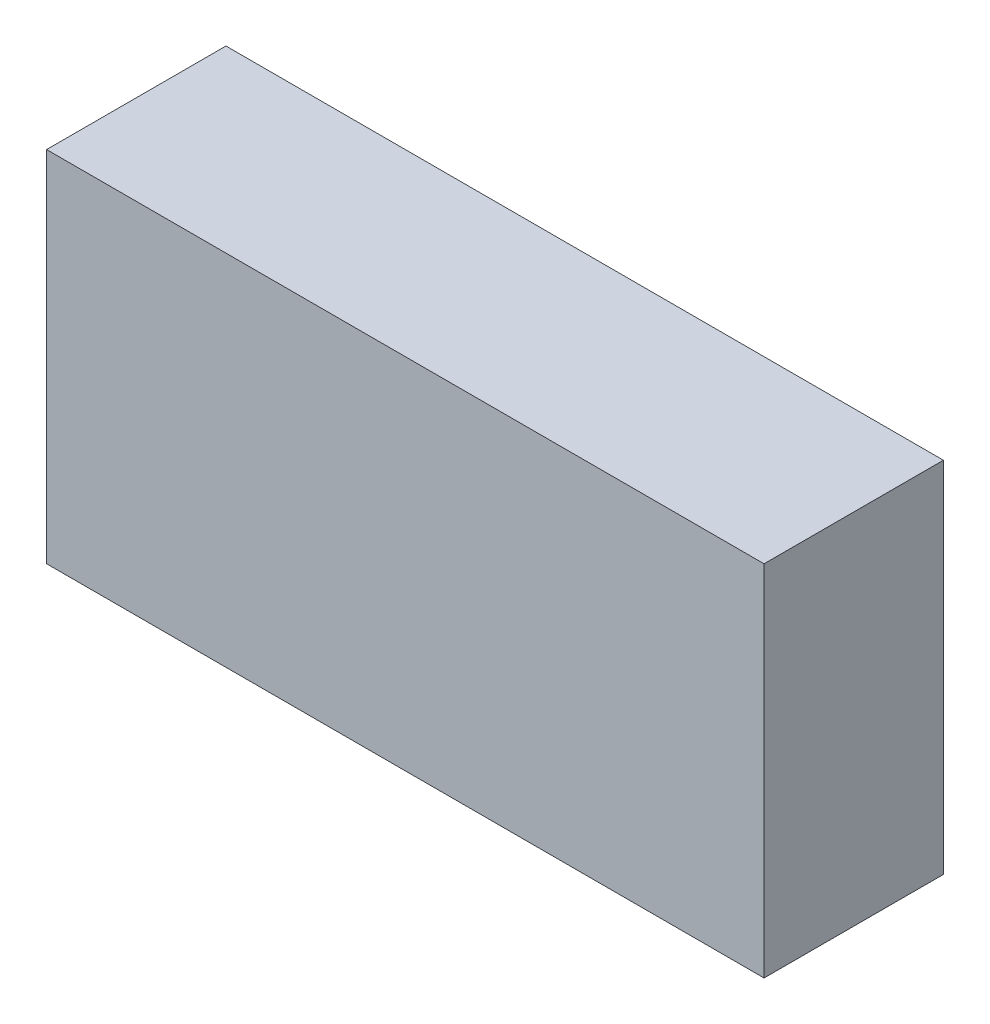
ISO-10303-21;
HEADER;
FILE_DESCRIPTION(('STEP AP214'),'2;1');
FILE_NAME('part.step','',(''),(''),'','','');
FILE_SCHEMA(('AUTOMOTIVE_DESIGN { 1 0 10303 214 1 1 1 1 }'));
ENDSEC;
DATA;
#1=APPLICATION_CONTEXT('core data for automotive mechanical design processes');
#2=APPLICATION_PROTOCOL_DEFINITION('international standard','automotive_design',2000,#1);
#3=PRODUCT_CONTEXT('',#1,'mechanical');
#4=PRODUCT('Part','Part','',(#3));
#5=PRODUCT_RELATED_PRODUCT_CATEGORY('part','',(#4));
#6=PRODUCT_DEFINITION_FORMATION('','',#4);
#7=PRODUCT_DEFINITION_CONTEXT('part definition',#1,'design');
#8=PRODUCT_DEFINITION('design','',#6,#7);
#9=PRODUCT_DEFINITION_SHAPE('','',#8);
#10=(LENGTH_UNIT() NAMED_UNIT(*) SI_UNIT(.MILLI.,.METRE.));
#11=(NAMED_UNIT(*) PLANE_ANGLE_UNIT() SI_UNIT($,.RADIAN.));
#12=(NAMED_UNIT(*) SI_UNIT($,.STERADIAN.) SOLID_ANGLE_UNIT());
#13=UNCERTAINTY_MEASURE_WITH_UNIT(LENGTH_MEASURE(1.E-05),#10,'distance_accuracy_value','');
#14=(GEOMETRIC_REPRESENTATION_CONTEXT(3) GLOBAL_UNCERTAINTY_ASSIGNED_CONTEXT((#13)) GLOBAL_UNIT_ASSIGNED_CONTEXT((#10,
#11,#12)) REPRESENTATION_CONTEXT('',''));
#15=CARTESIAN_POINT('',(0.,0.,0.));
#16=DIRECTION('',(0.,0.,1.));
#17=DIRECTION('',(1.,0.,0.));
#18=AXIS2_PLACEMENT_3D('',#15,#16,#17);
#19=CARTESIAN_POINT('',(0.824992,0.424992799999999,0.3999992));
#20=DIRECTION('',(-1.,0.,0.));
#21=DIRECTION('',(0.,0.,1.));
#22=AXIS2_PLACEMENT_3D('',#19,#20,#21);
#23=PLANE('',#22);
#24=DIRECTION('',(0.,1.,0.));
#25=VECTOR('',#24,1.);
#26=CARTESIAN_POINT('',(0.824992,0.424992799999999,0.));
#27=LINE('',#26,#25);
#28=CARTESIAN_POINT('',(0.824992,-0.375005599999997,0.));
#29=VERTEX_POINT('',#28);
#30=CARTESIAN_POINT('',(0.824992,0.424992799999999,0.));
#31=VERTEX_POINT('',#30);
#32=EDGE_CURVE('E95',#29,#31,#27,.T.);
#33=ORIENTED_EDGE('',*,*,#32,.T.);
#34=DIRECTION('',(0.,0.,-1.));
#35=VECTOR('',#34,1.);
#36=CARTESIAN_POINT('',(0.824992,0.424992799999999,0.3999992));
#37=LINE('',#36,#35);
#38=CARTESIAN_POINT('',(0.824992,0.424992799999999,0.3999992));
#39=VERTEX_POINT('',#38);
#40=EDGE_CURVE('E11',#39,#31,#37,.T.);
#41=ORIENTED_EDGE('',*,*,#40,.F.);
#42=DIRECTION('',(0.,1.,0.));
#43=VECTOR('',#42,1.);
#44=CARTESIAN_POINT('',(0.824992,0.424992799999999,0.3999992));
#45=LINE('',#44,#43);
#46=CARTESIAN_POINT('',(0.824992,-0.375005599999997,0.3999992));
#47=VERTEX_POINT('',#46);
#48=EDGE_CURVE('E83',#47,#39,#45,.T.);
#49=ORIENTED_EDGE('',*,*,#48,.F.);
#50=DIRECTION('',(0.,0.,-1.));
#51=VECTOR('',#50,1.);
#52=CARTESIAN_POINT('',(0.824992,-0.375005599999997,0.3999992));
#53=LINE('',#52,#51);
#54=EDGE_CURVE('E91',#47,#29,#53,.T.);
#55=ORIENTED_EDGE('',*,*,#54,.T.);
#56=EDGE_LOOP('',(#33,#41,#49,#55));
#57=FACE_BOUND('',#56,.T.);
#58=ADVANCED_FACE('F32',(#57),#23,.F.);
#59=CARTESIAN_POINT('',(-0.775004800000004,0.424992799999999,0.3999992));
#60=DIRECTION('',(0.,-1.,0.));
#61=DIRECTION('',(0.,0.,-1.));
#62=AXIS2_PLACEMENT_3D('',#59,#60,#61);
#63=PLANE('',#62);
#64=DIRECTION('',(-1.,0.,0.));
#65=VECTOR('',#64,1.);
#66=CARTESIAN_POINT('',(-0.775004800000004,0.424992799999999,0.));
#67=LINE('',#66,#65);
#68=CARTESIAN_POINT('',(-0.775004800000004,0.424992799999999,0.));
#69=VERTEX_POINT('',#68);
#70=EDGE_CURVE('E87',#31,#69,#67,.T.);
#71=ORIENTED_EDGE('',*,*,#70,.T.);
#72=DIRECTION('',(0.,0.,-1.));
#73=VECTOR('',#72,1.);
#74=CARTESIAN_POINT('',(-0.775004800000004,0.424992799999999,0.3999992));
#75=LINE('',#74,#73);
#76=CARTESIAN_POINT('',(-0.775004800000004,0.424992799999999,0.3999992));
#77=VERTEX_POINT('',#76);
#78=EDGE_CURVE('E40',#77,#69,#75,.T.);
#79=ORIENTED_EDGE('',*,*,#78,.F.);
#80=DIRECTION('',(-1.,0.,0.));
#81=VECTOR('',#80,1.);
#82=CARTESIAN_POINT('',(-0.775004800000004,0.424992799999999,0.3999992));
#83=LINE('',#82,#81);
#84=EDGE_CURVE('E78',#39,#77,#83,.T.);
#85=ORIENTED_EDGE('',*,*,#84,.F.);
#86=ORIENTED_EDGE('',*,*,#40,.T.);
#87=EDGE_LOOP('',(#71,#79,#85,#86));
#88=FACE_BOUND('',#87,.T.);
#89=ADVANCED_FACE('F86',(#88),#63,.F.);
#90=CARTESIAN_POINT('',(-0.775004800000004,-0.375005599999997,0.3999992));
#91=DIRECTION('',(1.,0.,0.));
#92=DIRECTION('',(0.,0.,-1.));
#93=AXIS2_PLACEMENT_3D('',#90,#91,#92);
#94=PLANE('',#93);
#95=DIRECTION('',(0.,-1.,0.));
#96=VECTOR('',#95,1.);
#97=CARTESIAN_POINT('',(-0.775004800000004,-0.375005599999997,0.));
#98=LINE('',#97,#96);
#99=CARTESIAN_POINT('',(-0.775004800000004,-0.375005599999997,0.));
#100=VERTEX_POINT('',#99);
#101=EDGE_CURVE('E65',#69,#100,#98,.T.);
#102=ORIENTED_EDGE('',*,*,#101,.T.);
#103=DIRECTION('',(0.,0.,-1.));
#104=VECTOR('',#103,1.);
#105=CARTESIAN_POINT('',(-0.775004800000004,-0.375005599999997,0.3999992));
#106=LINE('',#105,#104);
#107=CARTESIAN_POINT('',(-0.775004800000004,-0.375005599999997,0.3999992));
#108=VERTEX_POINT('',#107);
#109=EDGE_CURVE('E88',#108,#100,#106,.T.);
#110=ORIENTED_EDGE('',*,*,#109,.F.);
#111=DIRECTION('',(0.,-1.,0.));
#112=VECTOR('',#111,1.);
#113=CARTESIAN_POINT('',(-0.775004800000004,-0.375005599999997,0.3999992));
#114=LINE('',#113,#112);
#115=EDGE_CURVE('E81',#77,#108,#114,.T.);
#116=ORIENTED_EDGE('',*,*,#115,.F.);
#117=ORIENTED_EDGE('',*,*,#78,.T.);
#118=EDGE_LOOP('',(#102,#110,#116,#117));
#119=FACE_BOUND('',#118,.T.);
#120=ADVANCED_FACE('F89',(#119),#94,.F.);
#121=CARTESIAN_POINT('',(0.824992,-0.375005599999997,0.3999992));
#122=DIRECTION('',(0.,1.,0.));
#123=DIRECTION('',(0.,0.,1.));
#124=AXIS2_PLACEMENT_3D('',#121,#122,#123);
#125=PLANE('',#124);
#126=DIRECTION('',(1.,0.,0.));
#127=VECTOR('',#126,1.);
#128=CARTESIAN_POINT('',(0.824992,-0.375005599999997,0.));
#129=LINE('',#128,#127);
#130=EDGE_CURVE('E71',#100,#29,#129,.T.);
#131=ORIENTED_EDGE('',*,*,#130,.T.);
#132=ORIENTED_EDGE('',*,*,#54,.F.);
#133=DIRECTION('',(1.,0.,0.));
#134=VECTOR('',#133,1.);
#135=CARTESIAN_POINT('',(0.824992,-0.375005599999997,0.3999992));
#136=LINE('',#135,#134);
#137=EDGE_CURVE('E48',#108,#47,#136,.T.);
#138=ORIENTED_EDGE('',*,*,#137,.F.);
#139=ORIENTED_EDGE('',*,*,#109,.T.);
#140=EDGE_LOOP('',(#131,#132,#138,#139));
#141=FACE_BOUND('',#140,.T.);
#142=ADVANCED_FACE('F102',(#141),#125,.F.);
#143=CARTESIAN_POINT('',(0.,0.,0.3999992));
#144=DIRECTION('',(0.,0.,-1.));
#145=DIRECTION('',(-1.,0.,0.));
#146=AXIS2_PLACEMENT_3D('',#143,#144,#145);
#147=PLANE('',#146);
#148=ORIENTED_EDGE('',*,*,#48,.T.);
#149=ORIENTED_EDGE('',*,*,#84,.T.);
#150=ORIENTED_EDGE('',*,*,#115,.T.);
#151=ORIENTED_EDGE('',*,*,#137,.T.);
#152=EDGE_LOOP('',(#148,#149,#150,#151));
#153=FACE_BOUND('',#152,.T.);
#154=ADVANCED_FACE('F79',(#153),#147,.F.);
#155=CARTESIAN_POINT('',(0.,0.,0.));
#156=DIRECTION('',(0.,0.,-1.));
#157=DIRECTION('',(-1.,0.,0.));
#158=AXIS2_PLACEMENT_3D('',#155,#156,#157);
#159=PLANE('',#158);
#160=ORIENTED_EDGE('',*,*,#32,.F.);
#161=ORIENTED_EDGE('',*,*,#130,.F.);
#162=ORIENTED_EDGE('',*,*,#101,.F.);
#163=ORIENTED_EDGE('',*,*,#70,.F.);
#164=EDGE_LOOP('',(#160,#161,#162,#163));
#165=FACE_BOUND('',#164,.T.);
#166=ADVANCED_FACE('F105',(#165),#159,.T.);
#167=CLOSED_SHELL('',(#58,#89,#120,#142,#154,#166));
#168=MANIFOLD_SOLID_BREP('B2',#167);
#169=ADVANCED_BREP_SHAPE_REPRESENTATION('',(#18,#168),#14);
#170=SHAPE_DEFINITION_REPRESENTATION(#9,#169);
ENDSEC;
END-ISO-10303-21;
